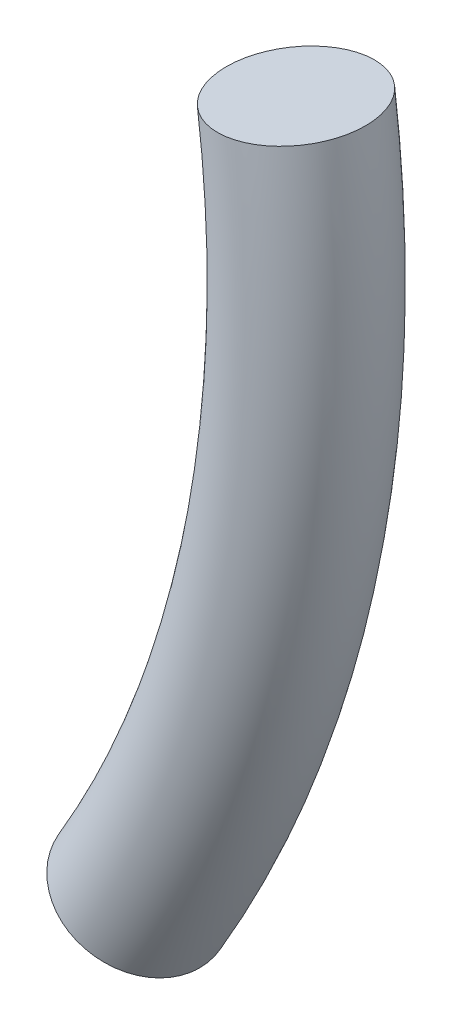
ISO-10303-21;
HEADER;
FILE_DESCRIPTION(('STEP AP214'),'2;1');
FILE_NAME('part.step','',(''),(''),'','','');
FILE_SCHEMA(('AUTOMOTIVE_DESIGN { 1 0 10303 214 1 1 1 1 }'));
ENDSEC;
DATA;
#1=APPLICATION_CONTEXT('core data for automotive mechanical design processes');
#2=APPLICATION_PROTOCOL_DEFINITION('international standard','automotive_design',2000,#1);
#3=PRODUCT_CONTEXT('',#1,'mechanical');
#4=PRODUCT('Part','Part','',(#3));
#5=PRODUCT_RELATED_PRODUCT_CATEGORY('part','',(#4));
#6=PRODUCT_DEFINITION_FORMATION('','',#4);
#7=PRODUCT_DEFINITION_CONTEXT('part definition',#1,'design');
#8=PRODUCT_DEFINITION('design','',#6,#7);
#9=PRODUCT_DEFINITION_SHAPE('','',#8);
#10=(LENGTH_UNIT() NAMED_UNIT(*) SI_UNIT(.MILLI.,.METRE.));
#11=(NAMED_UNIT(*) PLANE_ANGLE_UNIT() SI_UNIT($,.RADIAN.));
#12=(NAMED_UNIT(*) SI_UNIT($,.STERADIAN.) SOLID_ANGLE_UNIT());
#13=UNCERTAINTY_MEASURE_WITH_UNIT(LENGTH_MEASURE(1.E-05),#10,'distance_accuracy_value','');
#14=(GEOMETRIC_REPRESENTATION_CONTEXT(3) GLOBAL_UNCERTAINTY_ASSIGNED_CONTEXT((#13)) GLOBAL_UNIT_ASSIGNED_CONTEXT((#10,
#11,#12)) REPRESENTATION_CONTEXT('',''));
#15=CARTESIAN_POINT('',(0.,0.,0.));
#16=DIRECTION('',(0.,0.,1.));
#17=DIRECTION('',(1.,0.,0.));
#18=AXIS2_PLACEMENT_3D('',#15,#16,#17);
#19=CARTESIAN_POINT('',(0.,0.,-107.5));
#20=DIRECTION('',(-0.508108955981549,-0.861292800882105,0.));
#21=DIRECTION('',(0.861292800882105,-0.508108955981549,0.));
#22=AXIS2_PLACEMENT_3D('',#19,#20,#21);
#23=PLANE('',#22);
#24=CARTESIAN_POINT('',(6.25485975290933,-3.68997657429255,-102.2302));
#25=CARTESIAN_POINT('',(6.25485816323989,-3.68997563648687,-102.25265524156));
#26=CARTESIAN_POINT('',(6.25322515039492,-3.68901226090668,-102.275130857259));
#27=CARTESIAN_POINT('',(6.24672849525283,-3.68517964015536,-102.319482451298));
#28=CARTESIAN_POINT('',(6.24185793868046,-3.68230631599371,-102.341357041711));
#29=CARTESIAN_POINT('',(6.22903129999043,-3.67473940032128,-102.383809618347));
#30=CARTESIAN_POINT('',(6.22108072499369,-3.67004905766788,-102.404389843003));
#31=CARTESIAN_POINT('',(6.20230499207468,-3.65897254798209,-102.443737337222));
#32=CARTESIAN_POINT('',(6.1914757562349,-3.65258397523309,-102.46250198299));
#33=CARTESIAN_POINT('',(6.16727316374216,-3.63830595736166,-102.497627484938));
#34=CARTESIAN_POINT('',(6.15390341598872,-3.63041864126453,-102.513991693303));
#35=CARTESIAN_POINT('',(6.12496844257035,-3.61334881423253,-102.543904884907));
#36=CARTESIAN_POINT('',(6.10940016965359,-3.60416450560942,-102.557449895039));
#37=CARTESIAN_POINT('',(6.07653700727907,-3.58477729244884,-102.581301941874));
#38=CARTESIAN_POINT('',(6.05924338367778,-3.57457513468763,-102.5916113298));
#39=CARTESIAN_POINT('',(6.02340981955868,-3.5534355700297,-102.608713483024));
#40=CARTESIAN_POINT('',(6.00486980579158,-3.54249811992048,-102.615506041437));
#41=CARTESIAN_POINT('',(5.96707128206739,-3.52019935182736,-102.625380612929));
#42=CARTESIAN_POINT('',(5.94781279325628,-3.50883804631828,-102.628462735124));
#43=CARTESIAN_POINT('',(5.90912349051925,-3.48601377424584,-102.630829316177));
#44=CARTESIAN_POINT('',(5.88969267659333,-3.47455080768248,-102.630113775036));
#45=CARTESIAN_POINT('',(5.85120973319823,-3.45184827473254,-102.624905254934));
#46=CARTESIAN_POINT('',(5.83215761488276,-3.44060871492593,-102.620412164882));
#47=CARTESIAN_POINT('',(5.79497464241557,-3.41867308362697,-102.607776350926));
#48=CARTESIAN_POINT('',(5.77684373414364,-3.40797698020708,-102.599633841699));
#49=CARTESIAN_POINT('',(5.74200384045557,-3.38742361903858,-102.579923114515));
#50=CARTESIAN_POINT('',(5.7252959010978,-3.37756697839909,-102.568352403919));
#51=CARTESIAN_POINT('',(5.69381390434977,-3.35899456669023,-102.542134850302));
#52=CARTESIAN_POINT('',(5.67903717615128,-3.35027722001084,-102.527492330157));
#53=CARTESIAN_POINT('',(5.65178963762149,-3.33420287416555,-102.495513974748));
#54=CARTESIAN_POINT('',(5.63932211283187,-3.32684781326403,-102.478174365578));
#55=CARTESIAN_POINT('',(5.61708929239854,-3.31373183787524,-102.441335318358));
#56=CARTESIAN_POINT('',(5.60732017887115,-3.30796867107507,-102.421838987082));
#57=CARTESIAN_POINT('',(5.59072250275997,-3.298177078864,-102.381186262625));
#58=CARTESIAN_POINT('',(5.58389921422742,-3.29415176481391,-102.36002697154));
#59=CARTESIAN_POINT('',(5.57342461452557,-3.28797240523563,-102.316713490036));
#60=CARTESIAN_POINT('',(5.56976655296784,-3.2858143773999,-102.294561523395));
#61=CARTESIAN_POINT('',(5.56646119309682,-3.28386442152951,-102.258269762147));
#62=CARTESIAN_POINT('',(5.56582451835323,-3.28348882319764,-102.244238862857));
#63=CARTESIAN_POINT('',(5.56582710187308,-3.28349034731298,-102.20774475844));
#64=CARTESIAN_POINT('',(5.56746011471806,-3.28445372289318,-102.185269142741));
#65=CARTESIAN_POINT('',(5.57395676986015,-3.28828634364449,-102.140917548703));
#66=CARTESIAN_POINT('',(5.57882732643252,-3.29115966780615,-102.119042958289));
#67=CARTESIAN_POINT('',(5.59165396512254,-3.29872658347857,-102.076590381653));
#68=CARTESIAN_POINT('',(5.59960454011928,-3.30341692613197,-102.056010156997));
#69=CARTESIAN_POINT('',(5.61838027303829,-3.31449343581776,-102.016662662778));
#70=CARTESIAN_POINT('',(5.62920950887807,-3.32088200856676,-101.99789801701));
#71=CARTESIAN_POINT('',(5.65341210137081,-3.3351600264382,-101.962772515062));
#72=CARTESIAN_POINT('',(5.66678184912425,-3.34304734253533,-101.946408306697));
#73=CARTESIAN_POINT('',(5.69571682254262,-3.36011716956732,-101.916495115093));
#74=CARTESIAN_POINT('',(5.71128509545938,-3.36930147819044,-101.902950104961));
#75=CARTESIAN_POINT('',(5.7441482578339,-3.38868869135102,-101.879098058126));
#76=CARTESIAN_POINT('',(5.76144188143519,-3.39889084911222,-101.8687886702));
#77=CARTESIAN_POINT('',(5.7972754455543,-3.42003041377015,-101.851686516976));
#78=CARTESIAN_POINT('',(5.81581545932139,-3.43096786387938,-101.844893958563));
#79=CARTESIAN_POINT('',(5.85361398304558,-3.45326663197249,-101.835019387071));
#80=CARTESIAN_POINT('',(5.87287247185669,-3.46462793748158,-101.831937264876));
#81=CARTESIAN_POINT('',(5.91156177459373,-3.48745220955402,-101.829570683823));
#82=CARTESIAN_POINT('',(5.93099258851964,-3.49891517611737,-101.830286224964));
#83=CARTESIAN_POINT('',(5.96947553191474,-3.52161770906732,-101.835494745066));
#84=CARTESIAN_POINT('',(5.98852765023022,-3.53285726887393,-101.839987835118));
#85=CARTESIAN_POINT('',(6.02571062269741,-3.55479290017288,-101.852623649074));
#86=CARTESIAN_POINT('',(6.04384153096933,-3.56548900359278,-101.860766158301));
#87=CARTESIAN_POINT('',(6.0786814246574,-3.58604236476127,-101.880476885485));
#88=CARTESIAN_POINT('',(6.09538936401517,-3.59589900540076,-101.892047596081));
#89=CARTESIAN_POINT('',(6.1268713607632,-3.61447141710962,-101.918265149698));
#90=CARTESIAN_POINT('',(6.14164808896169,-3.62318876378902,-101.932907669844));
#91=CARTESIAN_POINT('',(6.16889562749148,-3.63926310963431,-101.964886025252));
#92=CARTESIAN_POINT('',(6.1813631522811,-3.64661817053583,-101.982225634422));
#93=CARTESIAN_POINT('',(6.20359597271444,-3.65973414592461,-102.019064681642));
#94=CARTESIAN_POINT('',(6.21336508624183,-3.66549731272478,-102.038561012918));
#95=CARTESIAN_POINT('',(6.229962762353,-3.67528890493585,-102.079213737375));
#96=CARTESIAN_POINT('',(6.23678605088555,-3.67931421898595,-102.10037302846));
#97=CARTESIAN_POINT('',(6.2472606505874,-3.68549357856422,-102.143686509964));
#98=CARTESIAN_POINT('',(6.25091871214514,-3.68765160639995,-102.165838476605));
#99=CARTESIAN_POINT('',(6.25422407201616,-3.68960156227035,-102.202130237853));
#100=CARTESIAN_POINT('',(6.25486074675974,-3.68997716060222,-102.216161137143));
#101=CARTESIAN_POINT('',(6.25485975290933,-3.68997657429255,-102.2302));
#102=B_SPLINE_CURVE_WITH_KNOTS('',3,(#24,#25,#26,#27,#28,#29,#30,#31,#32,#33,#34,#35,#36,#37,
#38,#39,#40,#41,#42,#43,#44,#45,#46,#47,#48,#49,#50,#51,#52,#53,#54,#55,#56,#57,#58,#59,#60,#61,
#62,#63,#64,#65,#66,#67,#68,#69,#70,#71,#72,#73,#74,#75,#76,#77,#78,#79,#80,#81,#82,#83,#84,#85,
#86,#87,#88,#89,#90,#91,#92,#93,#94,#95,#96,#97,#98,#99,#100,#101),.UNSPECIFIED.,.T.,.F.,(4,2,2,
2,2,2,2,2,2,2,2,2,2,2,2,2,2,2,2,2,2,2,2,2,2,2,2,2,2,2,2,2,2,2,2,2,2,2,4),(0.,0.0673217190940812,
0.134787678055445,0.202133559490879,0.269575356418609,0.336922056232665,0.404363034793442,
0.47175489208364,0.539150713403539,0.606544552708794,0.673938392014053,0.74133421333395,
0.808726070624147,0.876167049184932,0.943513748998996,1.01095554592845,1.07830142736559,
1.1457673863287,1.21308910542448,1.25517818200736,1.32249990110144,1.3899658600628,
1.45731174149823,1.52475353842596,1.59210023824002,1.6595412168008,1.726933074091,
1.7943288954109,1.86172273471615,1.92911657402141,1.99651239534131,2.0639042526315,
2.13134523119229,2.19869193100635,2.2661337279358,2.33347960937294,2.40094556833606,
2.46826728743184,2.51035636401471),.UNSPECIFIED.);
#103=CARTESIAN_POINT('',(6.25485975290933,-3.68997657429255,-102.2302));
#104=VERTEX_POINT('',#103);
#105=EDGE_CURVE('E18',#104,#104,#102,.T.);
#106=ORIENTED_EDGE('',*,*,#105,.F.);
#107=EDGE_LOOP('',(#106));
#108=FACE_BOUND('',#107,.T.);
#109=ADVANCED_FACE('F14',(#108),#23,.T.);
#110=CARTESIAN_POINT('',(0.,0.,-107.5));
#111=DIRECTION('',(0.129869475161102,-0.991531098564932,0.));
#112=DIRECTION('',(0.991531098564932,0.129869475161102,0.));
#113=AXIS2_PLACEMENT_3D('',#110,#111,#112);
#114=PLANE('',#113);
#115=CARTESIAN_POINT('',(6.40744829038855,0.839239382202968,-102.2302));
#116=CARTESIAN_POINT('',(6.40745012043598,0.83923962190024,-102.25265524156));
#117=CARTESIAN_POINT('',(6.4093300653496,0.839485854680649,-102.275130857259));
#118=CARTESIAN_POINT('',(6.41680909641016,0.840465448603577,-102.319482451298));
#119=CARTESIAN_POINT('',(6.42241614235769,0.841199852310596,-102.341357041711));
#120=CARTESIAN_POINT('',(6.4371823300446,0.843133908688461,-102.383809618347));
#121=CARTESIAN_POINT('',(6.44633513191717,0.844332730971659,-102.404389843003));
#122=CARTESIAN_POINT('',(6.46794999165881,0.847163817656069,-102.443737337222));
#123=CARTESIAN_POINT('',(6.48041674407777,0.848796696943421,-102.46250198299));
#124=CARTESIAN_POINT('',(6.50827907277467,0.852446069121327,-102.497627484938));
#125=CARTESIAN_POINT('',(6.52367049444211,0.854462017846312,-102.513991693303));
#126=CARTESIAN_POINT('',(6.55698079954518,0.858824959006158,-102.543904884907));
#127=CARTESIAN_POINT('',(6.57490319101542,0.861172410918903,-102.557449895039));
#128=CARTESIAN_POINT('',(6.61273567662096,0.866127661497268,-102.581301941874));
#129=CARTESIAN_POINT('',(6.63264431348638,0.868735269291542,-102.5916113298));
#130=CARTESIAN_POINT('',(6.67389636291733,0.874138409966273,-102.608713483024));
#131=CARTESIAN_POINT('',(6.69523985980836,0.876933953891575,-102.615506041437));
#132=CARTESIAN_POINT('',(6.73875399543564,0.882633379723182,-102.625380612929));
#133=CARTESIAN_POINT('',(6.76092460982836,0.885537258441005,-102.628462735124));
#134=CARTESIAN_POINT('',(6.80546422145204,0.89137099980708,-102.630829316177));
#135=CARTESIAN_POINT('',(6.827833218683,0.894300862455333,-102.630113775036));
#136=CARTESIAN_POINT('',(6.87213526683837,0.900103488062161,-102.624905254934));
#137=CARTESIAN_POINT('',(6.8940683049225,0.902976249338932,-102.620412164882));
#138=CARTESIAN_POINT('',(6.93687381020542,0.908582859674347,-102.607776350926));
#139=CARTESIAN_POINT('',(6.95774633970808,0.911316716893471,-102.599633841699));
#140=CARTESIAN_POINT('',(6.99785446324869,0.916570027618122,-102.579923114515));
#141=CARTESIAN_POINT('',(7.01708885305109,0.919089323394416,-102.568352403919));
#142=CARTESIAN_POINT('',(7.05333132342657,0.923836315811514,-102.542134850302));
#143=CARTESIAN_POINT('',(7.07034247866768,0.926064415168403,-102.527492330157));
#144=CARTESIAN_POINT('',(7.10171018751646,0.930172917555362,-102.495513974748));
#145=CARTESIAN_POINT('',(7.11606295876728,0.932052825177168,-102.478174365578));
#146=CARTESIAN_POINT('',(7.14165766110995,0.935405186555402,-102.441335318358));
#147=CARTESIAN_POINT('',(7.15290398739748,0.936878215988938,-102.421838987082));
#148=CARTESIAN_POINT('',(7.17201144076442,0.939380885793266,-102.381186262625));
#149=CARTESIAN_POINT('',(7.17986649628976,0.94040973091967,-102.36002697154));
#150=CARTESIAN_POINT('',(7.19192498712907,0.94198913662747,-102.316713490036));
#151=CARTESIAN_POINT('',(7.19613619357506,0.942540715061799,-102.294561523395));
#152=CARTESIAN_POINT('',(7.19994136540596,0.943039111601548,-102.258269762147));
#153=CARTESIAN_POINT('',(7.20067431337359,0.943135112188937,-102.244238862858));
#154=CARTESIAN_POINT('',(7.20067133919306,0.943134722634578,-102.20774475844));
#155=CARTESIAN_POINT('',(7.19879139427945,0.942888489854166,-102.185269142741));
#156=CARTESIAN_POINT('',(7.19131236321889,0.941908895931236,-102.140917548703));
#157=CARTESIAN_POINT('',(7.18570531727135,0.941174492224218,-102.119042958289));
#158=CARTESIAN_POINT('',(7.17093912958444,0.939240435846354,-102.076590381653));
#159=CARTESIAN_POINT('',(7.16178632771188,0.938041613563157,-102.056010156997));
#160=CARTESIAN_POINT('',(7.14017146797024,0.935210526878745,-102.016662662778));
#161=CARTESIAN_POINT('',(7.12770471555127,0.933577647591392,-101.99789801701));
#162=CARTESIAN_POINT('',(7.09984238685437,0.929928275413485,-101.962772515062));
#163=CARTESIAN_POINT('',(7.08445096518694,0.9279123266885,-101.946408306697));
#164=CARTESIAN_POINT('',(7.05114066008386,0.923549385528658,-101.916495115093));
#165=CARTESIAN_POINT('',(7.03321826861362,0.921201933615915,-101.902950104961));
#166=CARTESIAN_POINT('',(6.99538578300808,0.916246683037549,-101.879098058126));
#167=CARTESIAN_POINT('',(6.97547714614267,0.913639075243273,-101.8687886702));
#168=CARTESIAN_POINT('',(6.93422509671171,0.90823593456854,-101.851686516976));
#169=CARTESIAN_POINT('',(6.91288159982068,0.905440390643239,-101.844893958563));
#170=CARTESIAN_POINT('',(6.86936746419341,0.899740964811632,-101.835019387071));
#171=CARTESIAN_POINT('',(6.84719684980069,0.896837086093809,-101.831937264876));
#172=CARTESIAN_POINT('',(6.80265723817701,0.891003344727736,-101.829570683823));
#173=CARTESIAN_POINT('',(6.78028824094605,0.888073482079486,-101.830286224964));
#174=CARTESIAN_POINT('',(6.73598619279068,0.882270856472658,-101.835494745066));
#175=CARTESIAN_POINT('',(6.71405315470655,0.879398095195882,-101.839987835118));
#176=CARTESIAN_POINT('',(6.67124764942363,0.873791484860468,-101.852623649074));
#177=CARTESIAN_POINT('',(6.65037511992096,0.871057627641348,-101.860766158301));
#178=CARTESIAN_POINT('',(6.61026699638035,0.865804316916697,-101.880476885485));
#179=CARTESIAN_POINT('',(6.59103260657796,0.863285021140399,-101.892047596081));
#180=CARTESIAN_POINT('',(6.55479013620247,0.8585380287233,-101.918265149698));
#181=CARTESIAN_POINT('',(6.53777898096137,0.856309929366414,-101.932907669844));
#182=CARTESIAN_POINT('',(6.50641127211258,0.852201426979455,-101.964886025252));
#183=CARTESIAN_POINT('',(6.49205850086177,0.850321519357647,-101.982225634422));
#184=CARTESIAN_POINT('',(6.4664637985191,0.846969157979412,-102.019064681642));
#185=CARTESIAN_POINT('',(6.45521747223157,0.845496128545878,-102.038561012918));
#186=CARTESIAN_POINT('',(6.43611001886462,0.842993458741551,-102.079213737375));
#187=CARTESIAN_POINT('',(6.42825496333929,0.841964613615145,-102.10037302846));
#188=CARTESIAN_POINT('',(6.41619647249998,0.840385207907343,-102.143686509964));
#189=CARTESIAN_POINT('',(6.41198526605398,0.839833629473014,-102.165838476605));
#190=CARTESIAN_POINT('',(6.40818009422308,0.839335232933267,-102.202130237853));
#191=CARTESIAN_POINT('',(6.40744714625546,0.839239232345879,-102.216161137143));
#192=CARTESIAN_POINT('',(6.40744829038855,0.839239382202968,-102.2302));
#193=B_SPLINE_CURVE_WITH_KNOTS('',3,(#115,#116,#117,#118,#119,#120,#121,#122,#123,#124,#125,
#126,#127,#128,#129,#130,#131,#132,#133,#134,#135,#136,#137,#138,#139,#140,#141,#142,#143,#144,
#145,#146,#147,#148,#149,#150,#151,#152,#153,#154,#155,#156,#157,#158,#159,#160,#161,#162,#163,
#164,#165,#166,#167,#168,#169,#170,#171,#172,#173,#174,#175,#176,#177,#178,#179,#180,#181,#182,
#183,#184,#185,#186,#187,#188,#189,#190,#191,#192),.UNSPECIFIED.,.T.,.F.,(4,2,2,2,2,2,2,2,2,2,2,
2,2,2,2,2,2,2,2,2,2,2,2,2,2,2,2,2,2,2,2,2,2,2,2,2,2,2,4),(0.,0.0673217190940813,
0.134787678055445,0.202133559490878,0.269575356418609,0.336922056232665,0.404363034793442,
0.47175489208364,0.53915071340354,0.606544552708795,0.673938392014053,0.74133421333395,
0.808726070624147,0.87616704918493,0.943513748998995,1.01095554592842,1.07830142736557,
1.14576738632868,1.21308910542446,1.25517818200736,1.32249990110144,1.3899658600628,
1.45731174149825,1.52475353842597,1.59210023824003,1.6595412168008,1.726933074091,
1.7943288954109,1.86172273471615,1.92911657402141,1.99651239534131,2.0639042526315,
2.13134523119229,2.19869193100635,2.26613372793577,2.33347960937293,2.40094556833603,
2.46826728743182,2.51035636401472),.UNSPECIFIED.);
#194=CARTESIAN_POINT('',(6.40744829038855,0.839239382202968,-102.2302));
#195=VERTEX_POINT('',#194);
#196=EDGE_CURVE('E10',#195,#195,#193,.T.);
#197=ORIENTED_EDGE('',*,*,#196,.F.);
#198=EDGE_LOOP('',(#197));
#199=FACE_BOUND('',#198,.T.);
#200=ADVANCED_FACE('F34',(#199),#114,.F.);
#201=CARTESIAN_POINT('',(0.,0.,-102.2302));
#202=DIRECTION('',(0.,0.,1.));
#203=DIRECTION('',(-0.508108955981549,-0.861292800882104,0.));
#204=AXIS2_PLACEMENT_3D('',#201,#202,#203);
#205=TOROIDAL_SURFACE('',#204,6.86217582046821,0.4);
#206=ORIENTED_EDGE('',*,*,#105,.T.);
#207=EDGE_LOOP('',(#206));
#208=FACE_BOUND('',#207,.T.);
#209=ORIENTED_EDGE('',*,*,#196,.T.);
#210=EDGE_LOOP('',(#209));
#211=FACE_BOUND('',#210,.T.);
#212=ADVANCED_FACE('F36',(#208,#211),#205,.T.);
#213=CLOSED_SHELL('',(#109,#200,#212));
#214=MANIFOLD_SOLID_BREP('B1',#213);
#215=ADVANCED_BREP_SHAPE_REPRESENTATION('',(#18,#214),#14);
#216=SHAPE_DEFINITION_REPRESENTATION(#9,#215);
ENDSEC;
END-ISO-10303-21;
